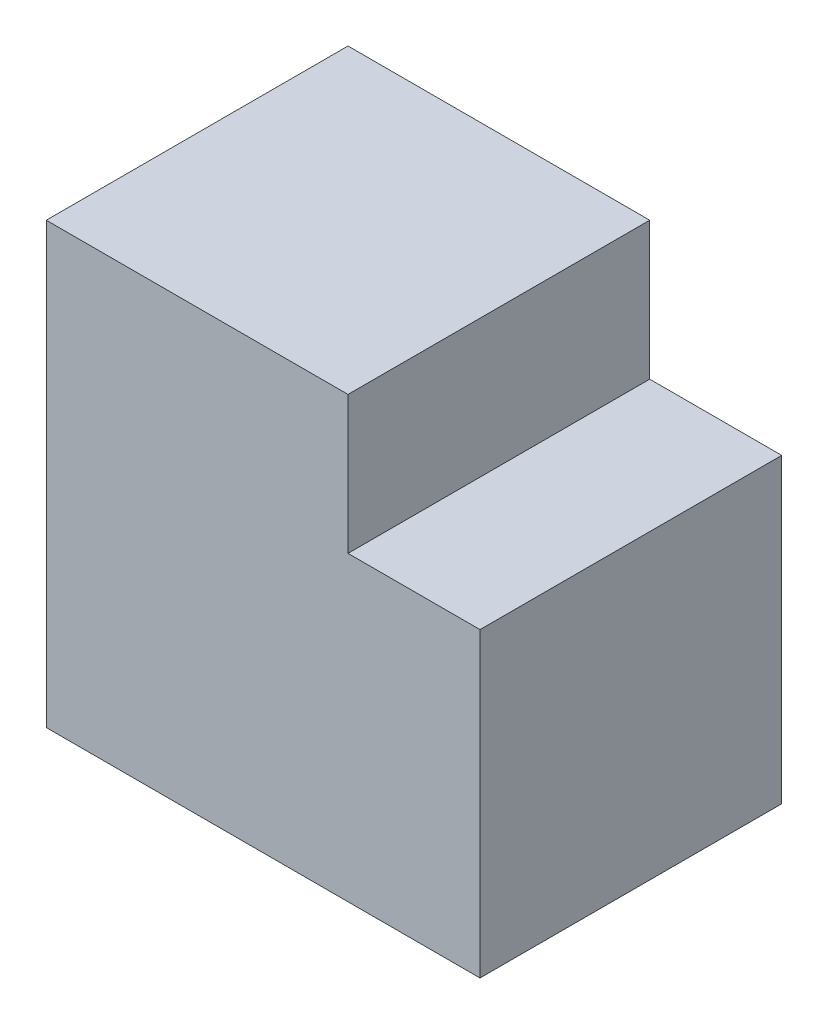
ISO-10303-21;
HEADER;
FILE_DESCRIPTION(('STEP AP214'),'2;1');
FILE_NAME('part.step','',(''),(''),'','','');
FILE_SCHEMA(('AUTOMOTIVE_DESIGN { 1 0 10303 214 1 1 1 1 }'));
ENDSEC;
DATA;
#1=APPLICATION_CONTEXT('core data for automotive mechanical design processes');
#2=APPLICATION_PROTOCOL_DEFINITION('international standard','automotive_design',2000,#1);
#3=PRODUCT_CONTEXT('',#1,'mechanical');
#4=PRODUCT('Part','Part','',(#3));
#5=PRODUCT_RELATED_PRODUCT_CATEGORY('part','',(#4));
#6=PRODUCT_DEFINITION_FORMATION('','',#4);
#7=PRODUCT_DEFINITION_CONTEXT('part definition',#1,'design');
#8=PRODUCT_DEFINITION('design','',#6,#7);
#9=PRODUCT_DEFINITION_SHAPE('','',#8);
#10=(LENGTH_UNIT() NAMED_UNIT(*) SI_UNIT(.MILLI.,.METRE.));
#11=(NAMED_UNIT(*) PLANE_ANGLE_UNIT() SI_UNIT($,.RADIAN.));
#12=(NAMED_UNIT(*) SI_UNIT($,.STERADIAN.) SOLID_ANGLE_UNIT());
#13=UNCERTAINTY_MEASURE_WITH_UNIT(LENGTH_MEASURE(1.E-05),#10,'distance_accuracy_value','');
#14=(GEOMETRIC_REPRESENTATION_CONTEXT(3) GLOBAL_UNCERTAINTY_ASSIGNED_CONTEXT((#13)) GLOBAL_UNIT_ASSIGNED_CONTEXT((#10,
#11,#12)) REPRESENTATION_CONTEXT('',''));
#15=CARTESIAN_POINT('',(0.,0.,0.));
#16=DIRECTION('',(0.,0.,1.));
#17=DIRECTION('',(1.,0.,0.));
#18=AXIS2_PLACEMENT_3D('',#15,#16,#17);
#19=CARTESIAN_POINT('',(1.33722562362246,59.182,-26.5568316831683));
#20=DIRECTION('',(-1.,0.,0.));
#21=DIRECTION('',(0.,0.,1.));
#22=AXIS2_PLACEMENT_3D('',#19,#20,#21);
#23=PLANE('',#22);
#24=DIRECTION('',(0.,0.,1.));
#25=VECTOR('',#24,1.);
#26=CARTESIAN_POINT('',(1.33722562362246,40.64,14.0831683168317));
#27=LINE('',#26,#25);
#28=CARTESIAN_POINT('',(1.33722562362246,40.64,-26.5568316831683));
#29=VERTEX_POINT('',#28);
#30=CARTESIAN_POINT('',(1.33722562362246,40.64,14.0831683168317));
#31=VERTEX_POINT('',#30);
#32=EDGE_CURVE('E96',#29,#31,#27,.T.);
#33=ORIENTED_EDGE('',*,*,#32,.F.);
#34=DIRECTION('',(0.,-1.,0.));
#35=VECTOR('',#34,1.);
#36=CARTESIAN_POINT('',(1.33722562362246,59.182,-26.5568316831683));
#37=LINE('',#36,#35);
#38=CARTESIAN_POINT('',(1.33722562362246,59.182,-26.5568316831683));
#39=VERTEX_POINT('',#38);
#40=EDGE_CURVE('E189',#39,#29,#37,.T.);
#41=ORIENTED_EDGE('',*,*,#40,.F.);
#42=DIRECTION('',(0.,0.,-1.));
#43=VECTOR('',#42,1.);
#44=CARTESIAN_POINT('',(1.33722562362246,59.182,-26.5568316831683));
#45=LINE('',#44,#43);
#46=CARTESIAN_POINT('',(1.33722562362246,59.182,14.0831683168317));
#47=VERTEX_POINT('',#46);
#48=EDGE_CURVE('E153',#47,#39,#45,.T.);
#49=ORIENTED_EDGE('',*,*,#48,.F.);
#50=DIRECTION('',(0.,-1.,0.));
#51=VECTOR('',#50,1.);
#52=CARTESIAN_POINT('',(1.33722562362246,59.182,14.0831683168317));
#53=LINE('',#52,#51);
#54=EDGE_CURVE('E182',#47,#31,#53,.T.);
#55=ORIENTED_EDGE('',*,*,#54,.T.);
#56=EDGE_LOOP('',(#33,#41,#49,#55));
#57=FACE_BOUND('',#56,.T.);
#58=ADVANCED_FACE('F33',(#57),#23,.F.);
#59=CARTESIAN_POINT('',(-39.3027743763775,59.182,-26.5568316831683));
#60=DIRECTION('',(0.,0.,1.));
#61=DIRECTION('',(1.,0.,0.));
#62=AXIS2_PLACEMENT_3D('',#59,#60,#61);
#63=PLANE('',#62);
#64=DIRECTION('',(-1.,0.,0.));
#65=VECTOR('',#64,1.);
#66=CARTESIAN_POINT('',(-39.3027743763775,0.,-26.5568316831683));
#67=LINE('',#66,#65);
#68=CARTESIAN_POINT('',(19.1172256236225,0.,-26.5568316831683));
#69=VERTEX_POINT('',#68);
#70=CARTESIAN_POINT('',(-39.3027743763775,0.,-26.5568316831683));
#71=VERTEX_POINT('',#70);
#72=EDGE_CURVE('E158',#69,#71,#67,.T.);
#73=ORIENTED_EDGE('',*,*,#72,.T.);
#74=DIRECTION('',(0.,-1.,0.));
#75=VECTOR('',#74,1.);
#76=CARTESIAN_POINT('',(-39.3027743763775,59.182,-26.5568316831683));
#77=LINE('',#76,#75);
#78=CARTESIAN_POINT('',(-39.3027743763775,59.182,-26.5568316831683));
#79=VERTEX_POINT('',#78);
#80=EDGE_CURVE('E187',#79,#71,#77,.T.);
#81=ORIENTED_EDGE('',*,*,#80,.F.);
#82=DIRECTION('',(-1.,0.,0.));
#83=VECTOR('',#82,1.);
#84=CARTESIAN_POINT('',(-39.3027743763775,59.182,-26.5568316831683));
#85=LINE('',#84,#83);
#86=EDGE_CURVE('E128',#39,#79,#85,.T.);
#87=ORIENTED_EDGE('',*,*,#86,.F.);
#88=ORIENTED_EDGE('',*,*,#40,.T.);
#89=DIRECTION('',(-1.,0.,0.));
#90=VECTOR('',#89,1.);
#91=CARTESIAN_POINT('',(19.1172256236225,40.64,-26.5568316831683));
#92=LINE('',#91,#90);
#93=CARTESIAN_POINT('',(19.1172256236225,40.64,-26.5568316831683));
#94=VERTEX_POINT('',#93);
#95=EDGE_CURVE('E174',#94,#29,#92,.T.);
#96=ORIENTED_EDGE('',*,*,#95,.F.);
#97=DIRECTION('',(0.,1.,0.));
#98=VECTOR('',#97,1.);
#99=CARTESIAN_POINT('',(19.1172256236225,40.64,-26.5568316831683));
#100=LINE('',#99,#98);
#101=EDGE_CURVE('E161',#69,#94,#100,.T.);
#102=ORIENTED_EDGE('',*,*,#101,.F.);
#103=EDGE_LOOP('',(#73,#81,#87,#88,#96,#102));
#104=FACE_BOUND('',#103,.T.);
#105=ADVANCED_FACE('F363',(#104),#63,.F.);
#106=CARTESIAN_POINT('',(-39.3027743763775,59.182,-26.5568316831683));
#107=DIRECTION('',(1.,0.,0.));
#108=DIRECTION('',(0.,0.,-1.));
#109=AXIS2_PLACEMENT_3D('',#106,#107,#108);
#110=PLANE('',#109);
#111=DIRECTION('',(0.,0.,1.));
#112=VECTOR('',#111,1.);
#113=CARTESIAN_POINT('',(-39.3027743763775,0.,-26.5568316831683));
#114=LINE('',#113,#112);
#115=CARTESIAN_POINT('',(-39.3027743763775,0.,14.0831683168317));
#116=VERTEX_POINT('',#115);
#117=EDGE_CURVE('E121',#71,#116,#114,.T.);
#118=ORIENTED_EDGE('',*,*,#117,.T.);
#119=DIRECTION('',(0.,-1.,0.));
#120=VECTOR('',#119,1.);
#121=CARTESIAN_POINT('',(-39.3027743763775,59.182,14.0831683168317));
#122=LINE('',#121,#120);
#123=CARTESIAN_POINT('',(-39.3027743763775,59.182,14.0831683168317));
#124=VERTEX_POINT('',#123);
#125=EDGE_CURVE('E151',#124,#116,#122,.T.);
#126=ORIENTED_EDGE('',*,*,#125,.F.);
#127=DIRECTION('',(0.,0.,1.));
#128=VECTOR('',#127,1.);
#129=CARTESIAN_POINT('',(-39.3027743763775,59.182,-26.5568316831683));
#130=LINE('',#129,#128);
#131=EDGE_CURVE('E179',#79,#124,#130,.T.);
#132=ORIENTED_EDGE('',*,*,#131,.F.);
#133=ORIENTED_EDGE('',*,*,#80,.T.);
#134=EDGE_LOOP('',(#118,#126,#132,#133));
#135=FACE_BOUND('',#134,.T.);
#136=ADVANCED_FACE('F355',(#135),#110,.F.);
#137=CARTESIAN_POINT('',(-39.3027743763775,59.182,14.0831683168317));
#138=DIRECTION('',(0.,0.,-1.));
#139=DIRECTION('',(-1.,0.,0.));
#140=AXIS2_PLACEMENT_3D('',#137,#138,#139);
#141=PLANE('',#140);
#142=DIRECTION('',(1.,0.,0.));
#143=VECTOR('',#142,1.);
#144=CARTESIAN_POINT('',(-39.3027743763775,0.,14.0831683168317));
#145=LINE('',#144,#143);
#146=CARTESIAN_POINT('',(19.1172256236225,0.,14.0831683168317));
#147=VERTEX_POINT('',#146);
#148=EDGE_CURVE('E145',#116,#147,#145,.T.);
#149=ORIENTED_EDGE('',*,*,#148,.T.);
#150=DIRECTION('',(0.,-1.,0.));
#151=VECTOR('',#150,1.);
#152=CARTESIAN_POINT('',(19.1172256236225,40.64,14.0831683168317));
#153=LINE('',#152,#151);
#154=CARTESIAN_POINT('',(19.1172256236225,40.64,14.0831683168317));
#155=VERTEX_POINT('',#154);
#156=EDGE_CURVE('E150',#155,#147,#153,.T.);
#157=ORIENTED_EDGE('',*,*,#156,.F.);
#158=DIRECTION('',(-1.,0.,0.));
#159=VECTOR('',#158,1.);
#160=CARTESIAN_POINT('',(19.1172256236225,40.64,14.0831683168317));
#161=LINE('',#160,#159);
#162=EDGE_CURVE('E171',#155,#31,#161,.T.);
#163=ORIENTED_EDGE('',*,*,#162,.T.);
#164=ORIENTED_EDGE('',*,*,#54,.F.);
#165=DIRECTION('',(1.,0.,0.));
#166=VECTOR('',#165,1.);
#167=CARTESIAN_POINT('',(-39.3027743763775,59.182,14.0831683168317));
#168=LINE('',#167,#166);
#169=EDGE_CURVE('E105',#124,#47,#168,.T.);
#170=ORIENTED_EDGE('',*,*,#169,.F.);
#171=ORIENTED_EDGE('',*,*,#125,.T.);
#172=EDGE_LOOP('',(#149,#157,#163,#164,#170,#171));
#173=FACE_BOUND('',#172,.T.);
#174=ADVANCED_FACE('F147',(#173),#141,.F.);
#175=CARTESIAN_POINT('',(0.,59.182,0.));
#176=DIRECTION('',(0.,1.,0.));
#177=DIRECTION('',(0.,0.,1.));
#178=AXIS2_PLACEMENT_3D('',#175,#176,#177);
#179=PLANE('',#178);
#180=ORIENTED_EDGE('',*,*,#48,.T.);
#181=ORIENTED_EDGE('',*,*,#86,.T.);
#182=ORIENTED_EDGE('',*,*,#131,.T.);
#183=ORIENTED_EDGE('',*,*,#169,.T.);
#184=EDGE_LOOP('',(#180,#181,#182,#183));
#185=FACE_BOUND('',#184,.T.);
#186=ADVANCED_FACE('F344',(#185),#179,.T.);
#187=CARTESIAN_POINT('',(0.,0.,0.));
#188=DIRECTION('',(0.,1.,0.));
#189=DIRECTION('',(0.,0.,1.));
#190=AXIS2_PLACEMENT_3D('',#187,#188,#189);
#191=PLANE('',#190);
#192=ORIENTED_EDGE('',*,*,#72,.F.);
#193=DIRECTION('',(0.,0.,-1.));
#194=VECTOR('',#193,1.);
#195=CARTESIAN_POINT('',(19.1172256236225,0.,14.0831683168317));
#196=LINE('',#195,#194);
#197=EDGE_CURVE('E156',#147,#69,#196,.T.);
#198=ORIENTED_EDGE('',*,*,#197,.F.);
#199=ORIENTED_EDGE('',*,*,#148,.F.);
#200=ORIENTED_EDGE('',*,*,#117,.F.);
#201=EDGE_LOOP('',(#192,#198,#199,#200));
#202=FACE_BOUND('',#201,.T.);
#203=ADVANCED_FACE('F157',(#202),#191,.F.);
#204=CARTESIAN_POINT('',(19.1172256236225,40.64,14.0831683168317));
#205=DIRECTION('',(0.,-1.,0.));
#206=DIRECTION('',(0.,0.,-1.));
#207=AXIS2_PLACEMENT_3D('',#204,#205,#206);
#208=PLANE('',#207);
#209=ORIENTED_EDGE('',*,*,#32,.T.);
#210=ORIENTED_EDGE('',*,*,#162,.F.);
#211=DIRECTION('',(0.,0.,1.));
#212=VECTOR('',#211,1.);
#213=CARTESIAN_POINT('',(19.1172256236225,40.64,14.0831683168317));
#214=LINE('',#213,#212);
#215=EDGE_CURVE('E165',#94,#155,#214,.T.);
#216=ORIENTED_EDGE('',*,*,#215,.F.);
#217=ORIENTED_EDGE('',*,*,#95,.T.);
#218=EDGE_LOOP('',(#209,#210,#216,#217));
#219=FACE_BOUND('',#218,.T.);
#220=ADVANCED_FACE('F326',(#219),#208,.F.);
#221=CARTESIAN_POINT('',(19.1172256236225,0.,0.));
#222=DIRECTION('',(1.,0.,0.));
#223=DIRECTION('',(0.,0.,-1.));
#224=AXIS2_PLACEMENT_3D('',#221,#222,#223);
#225=PLANE('',#224);
#226=ORIENTED_EDGE('',*,*,#156,.T.);
#227=ORIENTED_EDGE('',*,*,#197,.T.);
#228=ORIENTED_EDGE('',*,*,#101,.T.);
#229=ORIENTED_EDGE('',*,*,#215,.T.);
#230=EDGE_LOOP('',(#226,#227,#228,#229));
#231=FACE_BOUND('',#230,.T.);
#232=ADVANCED_FACE('F163',(#231),#225,.T.);
#233=CLOSED_SHELL('',(#58,#105,#136,#174,#186,#203,#220,#232));
#234=CARTESIAN_POINT('',(-1.20277437637754,59.182,-26.5568316831683));
#235=DIRECTION('',(-1.,0.,0.));
#236=DIRECTION('',(0.,0.,1.));
#237=AXIS2_PLACEMENT_3D('',#234,#235,#236);
#238=PLANE('',#237);
#239=DIRECTION('',(0.,0.,1.));
#240=VECTOR('',#239,1.);
#241=CARTESIAN_POINT('',(-1.20277437637754,38.1,-26.5568316831683));
#242=LINE('',#241,#240);
#243=CARTESIAN_POINT('',(-1.20277437637754,38.1,-24.0168316831683));
#244=VERTEX_POINT('',#243);
#245=CARTESIAN_POINT('',(-1.20277437637754,38.1,11.5431683168317));
#246=VERTEX_POINT('',#245);
#247=EDGE_CURVE('E88',#244,#246,#242,.T.);
#248=ORIENTED_EDGE('',*,*,#247,.T.);
#249=DIRECTION('',(0.,-1.,0.));
#250=VECTOR('',#249,1.);
#251=CARTESIAN_POINT('',(-1.20277437637754,59.182,11.5431683168317));
#252=LINE('',#251,#250);
#253=CARTESIAN_POINT('',(-1.20277437637754,56.642,11.5431683168317));
#254=VERTEX_POINT('',#253);
#255=EDGE_CURVE('E37',#254,#246,#252,.T.);
#256=ORIENTED_EDGE('',*,*,#255,.F.);
#257=DIRECTION('',(0.,0.,-1.));
#258=VECTOR('',#257,1.);
#259=CARTESIAN_POINT('',(-1.20277437637754,56.642,-26.5568316831683));
#260=LINE('',#259,#258);
#261=CARTESIAN_POINT('',(-1.20277437637754,56.642,-24.0168316831683));
#262=VERTEX_POINT('',#261);
#263=EDGE_CURVE('E208',#254,#262,#260,.T.);
#264=ORIENTED_EDGE('',*,*,#263,.T.);
#265=DIRECTION('',(0.,-1.,0.));
#266=VECTOR('',#265,1.);
#267=CARTESIAN_POINT('',(-1.20277437637754,59.182,-24.0168316831683));
#268=LINE('',#267,#266);
#269=EDGE_CURVE('E223',#262,#244,#268,.T.);
#270=ORIENTED_EDGE('',*,*,#269,.T.);
#271=EDGE_LOOP('',(#248,#256,#264,#270));
#272=FACE_BOUND('',#271,.T.);
#273=ADVANCED_FACE('F252',(#272),#238,.T.);
#274=CARTESIAN_POINT('',(-39.3027743763775,59.182,-24.0168316831683));
#275=DIRECTION('',(0.,0.,1.));
#276=DIRECTION('',(1.,0.,0.));
#277=AXIS2_PLACEMENT_3D('',#274,#275,#276);
#278=PLANE('',#277);
#279=DIRECTION('',(-1.,0.,0.));
#280=VECTOR('',#279,1.);
#281=CARTESIAN_POINT('',(-39.3027743763775,2.54,-24.0168316831683));
#282=LINE('',#281,#280);
#283=CARTESIAN_POINT('',(16.5772256236225,2.54,-24.0168316831683));
#284=VERTEX_POINT('',#283);
#285=CARTESIAN_POINT('',(-36.7627743763775,2.54,-24.0168316831683));
#286=VERTEX_POINT('',#285);
#287=EDGE_CURVE('E224',#284,#286,#282,.T.);
#288=ORIENTED_EDGE('',*,*,#287,.F.);
#289=DIRECTION('',(0.,1.,0.));
#290=VECTOR('',#289,1.);
#291=CARTESIAN_POINT('',(16.5772256236225,59.182,-24.0168316831683));
#292=LINE('',#291,#290);
#293=CARTESIAN_POINT('',(16.5772256236225,38.1,-24.0168316831683));
#294=VERTEX_POINT('',#293);
#295=EDGE_CURVE('E44',#284,#294,#292,.T.);
#296=ORIENTED_EDGE('',*,*,#295,.T.);
#297=DIRECTION('',(-1.,0.,0.));
#298=VECTOR('',#297,1.);
#299=CARTESIAN_POINT('',(19.1172256236225,38.1,-24.0168316831683));
#300=LINE('',#299,#298);
#301=EDGE_CURVE('E198',#294,#244,#300,.T.);
#302=ORIENTED_EDGE('',*,*,#301,.T.);
#303=ORIENTED_EDGE('',*,*,#269,.F.);
#304=DIRECTION('',(-1.,0.,0.));
#305=VECTOR('',#304,1.);
#306=CARTESIAN_POINT('',(-39.3027743763775,56.642,-24.0168316831683));
#307=LINE('',#306,#305);
#308=CARTESIAN_POINT('',(-36.7627743763775,56.642,-24.0168316831683));
#309=VERTEX_POINT('',#308);
#310=EDGE_CURVE('E206',#262,#309,#307,.T.);
#311=ORIENTED_EDGE('',*,*,#310,.T.);
#312=DIRECTION('',(0.,-1.,0.));
#313=VECTOR('',#312,1.);
#314=CARTESIAN_POINT('',(-36.7627743763775,59.182,-24.0168316831683));
#315=LINE('',#314,#313);
#316=EDGE_CURVE('E218',#309,#286,#315,.T.);
#317=ORIENTED_EDGE('',*,*,#316,.T.);
#318=EDGE_LOOP('',(#288,#296,#302,#303,#311,#317));
#319=FACE_BOUND('',#318,.T.);
#320=ADVANCED_FACE('F232',(#319),#278,.T.);
#321=CARTESIAN_POINT('',(-36.7627743763775,59.182,-26.5568316831683));
#322=DIRECTION('',(1.,0.,0.));
#323=DIRECTION('',(0.,0.,-1.));
#324=AXIS2_PLACEMENT_3D('',#321,#322,#323);
#325=PLANE('',#324);
#326=DIRECTION('',(0.,0.,1.));
#327=VECTOR('',#326,1.);
#328=CARTESIAN_POINT('',(-36.7627743763775,2.54,-26.5568316831683));
#329=LINE('',#328,#327);
#330=CARTESIAN_POINT('',(-36.7627743763775,2.54,11.5431683168317));
#331=VERTEX_POINT('',#330);
#332=EDGE_CURVE('E221',#286,#331,#329,.T.);
#333=ORIENTED_EDGE('',*,*,#332,.F.);
#334=ORIENTED_EDGE('',*,*,#316,.F.);
#335=DIRECTION('',(0.,0.,1.));
#336=VECTOR('',#335,1.);
#337=CARTESIAN_POINT('',(-36.7627743763775,56.642,-26.5568316831683));
#338=LINE('',#337,#336);
#339=CARTESIAN_POINT('',(-36.7627743763775,56.642,11.5431683168317));
#340=VERTEX_POINT('',#339);
#341=EDGE_CURVE('E204',#309,#340,#338,.T.);
#342=ORIENTED_EDGE('',*,*,#341,.T.);
#343=DIRECTION('',(0.,-1.,0.));
#344=VECTOR('',#343,1.);
#345=CARTESIAN_POINT('',(-36.7627743763775,59.182,11.5431683168317));
#346=LINE('',#345,#344);
#347=EDGE_CURVE('E211',#340,#331,#346,.T.);
#348=ORIENTED_EDGE('',*,*,#347,.T.);
#349=EDGE_LOOP('',(#333,#334,#342,#348));
#350=FACE_BOUND('',#349,.T.);
#351=ADVANCED_FACE('F236',(#350),#325,.T.);
#352=CARTESIAN_POINT('',(-39.3027743763775,59.182,11.5431683168317));
#353=DIRECTION('',(0.,0.,-1.));
#354=DIRECTION('',(-1.,0.,0.));
#355=AXIS2_PLACEMENT_3D('',#352,#353,#354);
#356=PLANE('',#355);
#357=DIRECTION('',(1.,0.,0.));
#358=VECTOR('',#357,1.);
#359=CARTESIAN_POINT('',(-39.3027743763775,2.54,11.5431683168317));
#360=LINE('',#359,#358);
#361=CARTESIAN_POINT('',(16.5772256236225,2.54,11.5431683168317));
#362=VERTEX_POINT('',#361);
#363=EDGE_CURVE('E216',#331,#362,#360,.T.);
#364=ORIENTED_EDGE('',*,*,#363,.F.);
#365=ORIENTED_EDGE('',*,*,#347,.F.);
#366=DIRECTION('',(1.,0.,0.));
#367=VECTOR('',#366,1.);
#368=CARTESIAN_POINT('',(-39.3027743763775,56.642,11.5431683168317));
#369=LINE('',#368,#367);
#370=EDGE_CURVE('E202',#340,#254,#369,.T.);
#371=ORIENTED_EDGE('',*,*,#370,.T.);
#372=ORIENTED_EDGE('',*,*,#255,.T.);
#373=DIRECTION('',(-1.,0.,0.));
#374=VECTOR('',#373,1.);
#375=CARTESIAN_POINT('',(-39.3027743763775,38.1,11.5431683168317));
#376=LINE('',#375,#374);
#377=CARTESIAN_POINT('',(16.5772256236225,38.1,11.5431683168317));
#378=VERTEX_POINT('',#377);
#379=EDGE_CURVE('E214',#378,#246,#376,.T.);
#380=ORIENTED_EDGE('',*,*,#379,.F.);
#381=DIRECTION('',(0.,-1.,0.));
#382=VECTOR('',#381,1.);
#383=CARTESIAN_POINT('',(16.5772256236225,59.182,11.5431683168317));
#384=LINE('',#383,#382);
#385=EDGE_CURVE('E195',#378,#362,#384,.T.);
#386=ORIENTED_EDGE('',*,*,#385,.T.);
#387=EDGE_LOOP('',(#364,#365,#371,#372,#380,#386));
#388=FACE_BOUND('',#387,.T.);
#389=ADVANCED_FACE('F240',(#388),#356,.T.);
#390=CARTESIAN_POINT('',(0.,56.642,0.));
#391=DIRECTION('',(0.,1.,0.));
#392=DIRECTION('',(0.,0.,1.));
#393=AXIS2_PLACEMENT_3D('',#390,#391,#392);
#394=PLANE('',#393);
#395=ORIENTED_EDGE('',*,*,#263,.F.);
#396=ORIENTED_EDGE('',*,*,#370,.F.);
#397=ORIENTED_EDGE('',*,*,#341,.F.);
#398=ORIENTED_EDGE('',*,*,#310,.F.);
#399=EDGE_LOOP('',(#395,#396,#397,#398));
#400=FACE_BOUND('',#399,.T.);
#401=ADVANCED_FACE('F250',(#400),#394,.F.);
#402=CARTESIAN_POINT('',(0.,2.54,0.));
#403=DIRECTION('',(0.,1.,0.));
#404=DIRECTION('',(0.,0.,1.));
#405=AXIS2_PLACEMENT_3D('',#402,#403,#404);
#406=PLANE('',#405);
#407=ORIENTED_EDGE('',*,*,#287,.T.);
#408=ORIENTED_EDGE('',*,*,#332,.T.);
#409=ORIENTED_EDGE('',*,*,#363,.T.);
#410=DIRECTION('',(0.,0.,-1.));
#411=VECTOR('',#410,1.);
#412=CARTESIAN_POINT('',(16.5772256236225,2.54,0.));
#413=LINE('',#412,#411);
#414=EDGE_CURVE('E192',#362,#284,#413,.T.);
#415=ORIENTED_EDGE('',*,*,#414,.T.);
#416=EDGE_LOOP('',(#407,#408,#409,#415));
#417=FACE_BOUND('',#416,.T.);
#418=ADVANCED_FACE('F226',(#417),#406,.T.);
#419=CARTESIAN_POINT('',(19.1172256236225,38.1,14.0831683168317));
#420=DIRECTION('',(0.,-1.,0.));
#421=DIRECTION('',(0.,0.,-1.));
#422=AXIS2_PLACEMENT_3D('',#419,#420,#421);
#423=PLANE('',#422);
#424=ORIENTED_EDGE('',*,*,#247,.F.);
#425=ORIENTED_EDGE('',*,*,#301,.F.);
#426=DIRECTION('',(0.,0.,1.));
#427=VECTOR('',#426,1.);
#428=CARTESIAN_POINT('',(16.5772256236225,38.1,14.0831683168317));
#429=LINE('',#428,#427);
#430=EDGE_CURVE('E11',#294,#378,#429,.T.);
#431=ORIENTED_EDGE('',*,*,#430,.T.);
#432=ORIENTED_EDGE('',*,*,#379,.T.);
#433=EDGE_LOOP('',(#424,#425,#431,#432));
#434=FACE_BOUND('',#433,.T.);
#435=ADVANCED_FACE('F243',(#434),#423,.T.);
#436=CARTESIAN_POINT('',(16.5772256236225,0.,0.));
#437=DIRECTION('',(1.,0.,0.));
#438=DIRECTION('',(0.,0.,-1.));
#439=AXIS2_PLACEMENT_3D('',#436,#437,#438);
#440=PLANE('',#439);
#441=ORIENTED_EDGE('',*,*,#385,.F.);
#442=ORIENTED_EDGE('',*,*,#430,.F.);
#443=ORIENTED_EDGE('',*,*,#295,.F.);
#444=ORIENTED_EDGE('',*,*,#414,.F.);
#445=EDGE_LOOP('',(#441,#442,#443,#444));
#446=FACE_BOUND('',#445,.T.);
#447=ADVANCED_FACE('F35',(#446),#440,.F.);
#448=CLOSED_SHELL('',(#273,#320,#351,#389,#401,#418,#435,#447));
#449=ORIENTED_CLOSED_SHELL('',*,#448,.T.);
#450=BREP_WITH_VOIDS('B2',#233,(#449));
#451=ADVANCED_BREP_SHAPE_REPRESENTATION('',(#18,#450),#14);
#452=SHAPE_DEFINITION_REPRESENTATION(#9,#451);
ENDSEC;
END-ISO-10303-21;
